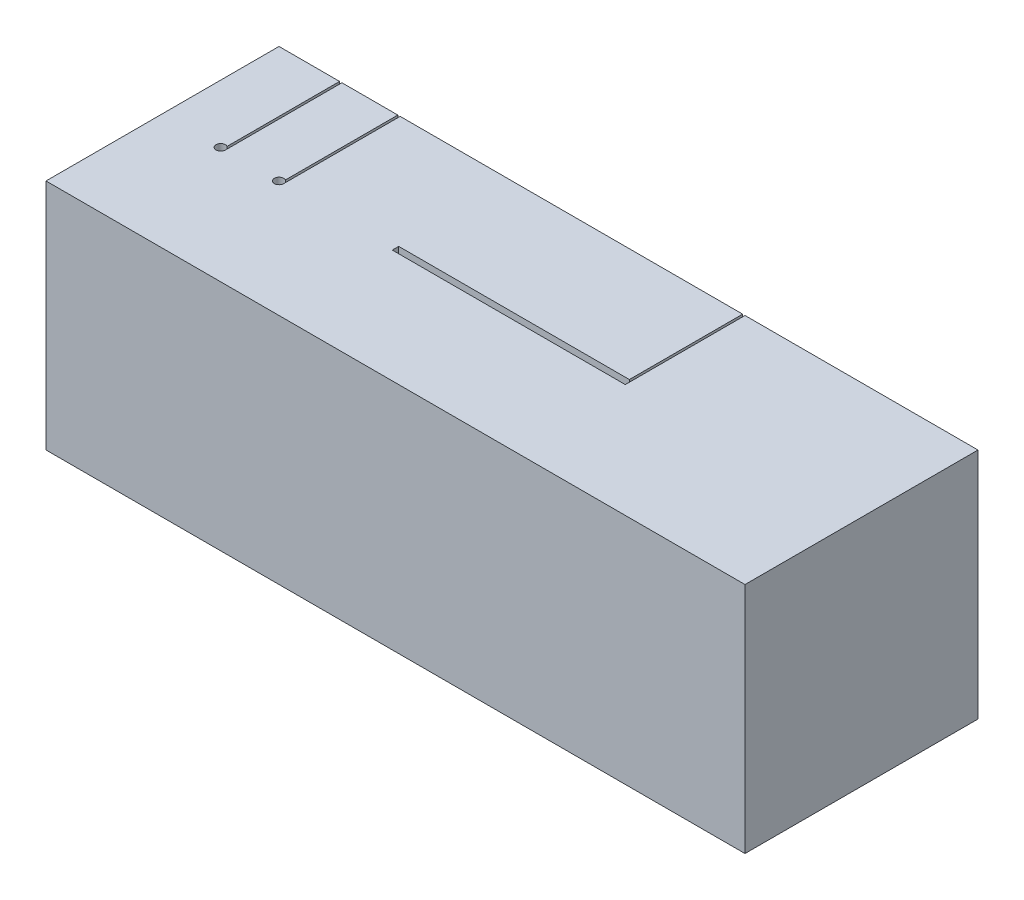
ISO-10303-21;
HEADER;
FILE_DESCRIPTION(('STEP AP214'),'2;1');
FILE_NAME('part.step','',(''),(''),'','','');
FILE_SCHEMA(('AUTOMOTIVE_DESIGN { 1 0 10303 214 1 1 1 1 }'));
ENDSEC;
DATA;
#1=APPLICATION_CONTEXT('core data for automotive mechanical design processes');
#2=APPLICATION_PROTOCOL_DEFINITION('international standard','automotive_design',2000,#1);
#3=PRODUCT_CONTEXT('',#1,'mechanical');
#4=PRODUCT('Part','Part','',(#3));
#5=PRODUCT_RELATED_PRODUCT_CATEGORY('part','',(#4));
#6=PRODUCT_DEFINITION_FORMATION('','',#4);
#7=PRODUCT_DEFINITION_CONTEXT('part definition',#1,'design');
#8=PRODUCT_DEFINITION('design','',#6,#7);
#9=PRODUCT_DEFINITION_SHAPE('','',#8);
#10=(LENGTH_UNIT() NAMED_UNIT(*) SI_UNIT(.MILLI.,.METRE.));
#11=(NAMED_UNIT(*) PLANE_ANGLE_UNIT() SI_UNIT($,.RADIAN.));
#12=(NAMED_UNIT(*) SI_UNIT($,.STERADIAN.) SOLID_ANGLE_UNIT());
#13=UNCERTAINTY_MEASURE_WITH_UNIT(LENGTH_MEASURE(1.E-05),#10,'distance_accuracy_value','');
#14=(GEOMETRIC_REPRESENTATION_CONTEXT(3) GLOBAL_UNCERTAINTY_ASSIGNED_CONTEXT((#13)) GLOBAL_UNIT_ASSIGNED_CONTEXT((#10,
#11,#12)) REPRESENTATION_CONTEXT('',''));
#15=CARTESIAN_POINT('',(0.,0.,0.));
#16=DIRECTION('',(0.,0.,1.));
#17=DIRECTION('',(1.,0.,0.));
#18=AXIS2_PLACEMENT_3D('',#15,#16,#17);
#19=CARTESIAN_POINT('',(0.,0.,0.));
#20=DIRECTION('',(0.,0.,-1.));
#21=DIRECTION('',(-1.,0.,0.));
#22=AXIS2_PLACEMENT_3D('',#19,#20,#21);
#23=PLANE('',#22);
#24=DIRECTION('',(0.,-1.,0.));
#25=VECTOR('',#24,1.);
#26=CARTESIAN_POINT('',(5.39999999999999,20.,0.));
#27=LINE('',#26,#25);
#28=CARTESIAN_POINT('',(5.39999999999999,20.,0.));
#29=VERTEX_POINT('',#28);
#30=CARTESIAN_POINT('',(5.39999999999999,0.,0.));
#31=VERTEX_POINT('',#30);
#32=EDGE_CURVE('E196',#29,#31,#27,.T.);
#33=ORIENTED_EDGE('',*,*,#32,.F.);
#34=DIRECTION('',(-1.,0.,0.));
#35=VECTOR('',#34,1.);
#36=CARTESIAN_POINT('',(0.,20.,0.));
#37=LINE('',#36,#35);
#38=CARTESIAN_POINT('',(10.2,20.,0.));
#39=VERTEX_POINT('',#38);
#40=EDGE_CURVE('E179',#39,#29,#37,.T.);
#41=ORIENTED_EDGE('',*,*,#40,.F.);
#42=DIRECTION('',(0.,-1.,0.));
#43=VECTOR('',#42,1.);
#44=CARTESIAN_POINT('',(10.2,20.,0.));
#45=LINE('',#44,#43);
#46=CARTESIAN_POINT('',(10.2,0.,0.));
#47=VERTEX_POINT('',#46);
#48=EDGE_CURVE('E288',#39,#47,#45,.T.);
#49=ORIENTED_EDGE('',*,*,#48,.T.);
#50=DIRECTION('',(1.,0.,0.));
#51=VECTOR('',#50,1.);
#52=CARTESIAN_POINT('',(0.,0.,0.));
#53=LINE('',#52,#51);
#54=EDGE_CURVE('E242',#31,#47,#53,.T.);
#55=ORIENTED_EDGE('',*,*,#54,.F.);
#56=EDGE_LOOP('',(#33,#41,#49,#55));
#57=FACE_BOUND('',#56,.T.);
#58=ADVANCED_FACE('F35',(#57),#23,.T.);
#59=DIRECTION('',(0.,-1.,0.));
#60=VECTOR('',#59,1.);
#61=CARTESIAN_POINT('',(10.4,20.,0.));
#62=LINE('',#61,#60);
#63=CARTESIAN_POINT('',(10.4,20.,0.));
#64=VERTEX_POINT('',#63);
#65=CARTESIAN_POINT('',(10.4,0.,0.));
#66=VERTEX_POINT('',#65);
#67=EDGE_CURVE('E286',#64,#66,#62,.T.);
#68=ORIENTED_EDGE('',*,*,#67,.F.);
#69=CARTESIAN_POINT('',(39.8,20.,0.));
#70=VERTEX_POINT('',#69);
#71=EDGE_CURVE('E247',#70,#64,#37,.T.);
#72=ORIENTED_EDGE('',*,*,#71,.F.);
#73=DIRECTION('',(0.,-1.,0.));
#74=VECTOR('',#73,1.);
#75=CARTESIAN_POINT('',(39.8,20.,0.));
#76=LINE('',#75,#74);
#77=CARTESIAN_POINT('',(39.8,0.,0.));
#78=VERTEX_POINT('',#77);
#79=EDGE_CURVE('E299',#70,#78,#76,.T.);
#80=ORIENTED_EDGE('',*,*,#79,.T.);
#81=EDGE_CURVE('E310',#66,#78,#53,.T.);
#82=ORIENTED_EDGE('',*,*,#81,.F.);
#83=EDGE_LOOP('',(#68,#72,#80,#82));
#84=FACE_BOUND('',#83,.T.);
#85=ADVANCED_FACE('F343',(#84),#23,.T.);
#86=DIRECTION('',(0.,-1.,0.));
#87=VECTOR('',#86,1.);
#88=CARTESIAN_POINT('',(40.,20.,0.));
#89=LINE('',#88,#87);
#90=CARTESIAN_POINT('',(40.,20.,0.));
#91=VERTEX_POINT('',#90);
#92=CARTESIAN_POINT('',(40.,0.,0.));
#93=VERTEX_POINT('',#92);
#94=EDGE_CURVE('E284',#91,#93,#89,.T.);
#95=ORIENTED_EDGE('',*,*,#94,.F.);
#96=CARTESIAN_POINT('',(60.,20.,0.));
#97=VERTEX_POINT('',#96);
#98=EDGE_CURVE('E228',#97,#91,#37,.T.);
#99=ORIENTED_EDGE('',*,*,#98,.F.);
#100=DIRECTION('',(0.,1.,0.));
#101=VECTOR('',#100,1.);
#102=CARTESIAN_POINT('',(60.,0.,0.));
#103=LINE('',#102,#101);
#104=CARTESIAN_POINT('',(60.,0.,0.));
#105=VERTEX_POINT('',#104);
#106=EDGE_CURVE('E241',#105,#97,#103,.T.);
#107=ORIENTED_EDGE('',*,*,#106,.F.);
#108=EDGE_CURVE('E237',#93,#105,#53,.T.);
#109=ORIENTED_EDGE('',*,*,#108,.F.);
#110=EDGE_LOOP('',(#95,#99,#107,#109));
#111=FACE_BOUND('',#110,.T.);
#112=ADVANCED_FACE('F329',(#111),#23,.T.);
#113=CARTESIAN_POINT('',(0.,0.,20.));
#114=DIRECTION('',(1.,0.,0.));
#115=DIRECTION('',(0.,1.,0.));
#116=AXIS2_PLACEMENT_3D('',#113,#114,#115);
#117=PLANE('',#116);
#118=DIRECTION('',(0.,-1.,0.));
#119=VECTOR('',#118,1.);
#120=CARTESIAN_POINT('',(0.,0.,0.));
#121=LINE('',#120,#119);
#122=CARTESIAN_POINT('',(0.,20.,0.));
#123=VERTEX_POINT('',#122);
#124=CARTESIAN_POINT('',(0.,0.,0.));
#125=VERTEX_POINT('',#124);
#126=EDGE_CURVE('E219',#123,#125,#121,.T.);
#127=ORIENTED_EDGE('',*,*,#126,.T.);
#128=DIRECTION('',(0.,0.,-1.));
#129=VECTOR('',#128,1.);
#130=CARTESIAN_POINT('',(0.,0.,20.));
#131=LINE('',#130,#129);
#132=CARTESIAN_POINT('',(0.,0.,20.));
#133=VERTEX_POINT('',#132);
#134=EDGE_CURVE('E256',#133,#125,#131,.T.);
#135=ORIENTED_EDGE('',*,*,#134,.F.);
#136=DIRECTION('',(0.,-1.,0.));
#137=VECTOR('',#136,1.);
#138=CARTESIAN_POINT('',(0.,0.,20.));
#139=LINE('',#138,#137);
#140=CARTESIAN_POINT('',(0.,20.,20.));
#141=VERTEX_POINT('',#140);
#142=EDGE_CURVE('E224',#141,#133,#139,.T.);
#143=ORIENTED_EDGE('',*,*,#142,.F.);
#144=DIRECTION('',(0.,0.,-1.));
#145=VECTOR('',#144,1.);
#146=CARTESIAN_POINT('',(0.,20.,20.));
#147=LINE('',#146,#145);
#148=EDGE_CURVE('E234',#141,#123,#147,.T.);
#149=ORIENTED_EDGE('',*,*,#148,.T.);
#150=EDGE_LOOP('',(#127,#135,#143,#149));
#151=FACE_BOUND('',#150,.T.);
#152=ADVANCED_FACE('F37',(#151),#117,.F.);
#153=CARTESIAN_POINT('',(0.,0.,20.));
#154=DIRECTION('',(0.,1.,0.));
#155=DIRECTION('',(0.,0.,1.));
#156=AXIS2_PLACEMENT_3D('',#153,#154,#155);
#157=PLANE('',#156);
#158=CARTESIAN_POINT('',(4.99999999999999,0.,10.));
#159=DIRECTION('',(0.,1.,0.));
#160=DIRECTION('',(0.,0.,1.));
#161=AXIS2_PLACEMENT_3D('',#158,#159,#160);
#162=CIRCLE('',#161,0.4);
#163=CARTESIAN_POINT('',(5.19999999999999,0.,9.65358983848622));
#164=VERTEX_POINT('',#163);
#165=CARTESIAN_POINT('',(5.39999999999999,0.,10.));
#166=VERTEX_POINT('',#165);
#167=EDGE_CURVE('E184',#164,#166,#162,.T.);
#168=ORIENTED_EDGE('',*,*,#167,.T.);
#169=DIRECTION('',(0.,0.,1.));
#170=VECTOR('',#169,1.);
#171=CARTESIAN_POINT('',(5.39999999999999,0.,10.));
#172=LINE('',#171,#170);
#173=EDGE_CURVE('E164',#31,#166,#172,.T.);
#174=ORIENTED_EDGE('',*,*,#173,.F.);
#175=ORIENTED_EDGE('',*,*,#54,.T.);
#176=DIRECTION('',(0.,0.,-1.));
#177=VECTOR('',#176,1.);
#178=CARTESIAN_POINT('',(10.2,0.,10.));
#179=LINE('',#178,#177);
#180=CARTESIAN_POINT('',(10.2,0.,9.65358983848622));
#181=VERTEX_POINT('',#180);
#182=EDGE_CURVE('E279',#181,#47,#179,.T.);
#183=ORIENTED_EDGE('',*,*,#182,.F.);
#184=CARTESIAN_POINT('',(9.99999999999999,0.,10.));
#185=DIRECTION('',(0.,1.,0.));
#186=DIRECTION('',(0.,0.,1.));
#187=AXIS2_PLACEMENT_3D('',#184,#185,#186);
#188=CIRCLE('',#187,0.399999999999999);
#189=CARTESIAN_POINT('',(10.4,0.,10.));
#190=VERTEX_POINT('',#189);
#191=EDGE_CURVE('E185',#181,#190,#188,.T.);
#192=ORIENTED_EDGE('',*,*,#191,.T.);
#193=DIRECTION('',(0.,0.,1.));
#194=VECTOR('',#193,1.);
#195=CARTESIAN_POINT('',(10.4,0.,10.));
#196=LINE('',#195,#194);
#197=EDGE_CURVE('E282',#66,#190,#196,.T.);
#198=ORIENTED_EDGE('',*,*,#197,.F.);
#199=ORIENTED_EDGE('',*,*,#81,.T.);
#200=DIRECTION('',(0.,0.,-1.));
#201=VECTOR('',#200,1.);
#202=CARTESIAN_POINT('',(39.8,0.,9.725));
#203=LINE('',#202,#201);
#204=CARTESIAN_POINT('',(39.8,0.,9.725));
#205=VERTEX_POINT('',#204);
#206=EDGE_CURVE('E295',#205,#78,#203,.T.);
#207=ORIENTED_EDGE('',*,*,#206,.F.);
#208=DIRECTION('',(-1.,0.,0.));
#209=VECTOR('',#208,1.);
#210=CARTESIAN_POINT('',(20.,0.,9.725));
#211=LINE('',#210,#209);
#212=CARTESIAN_POINT('',(20.,0.,9.725));
#213=VERTEX_POINT('',#212);
#214=EDGE_CURVE('E206',#205,#213,#211,.T.);
#215=ORIENTED_EDGE('',*,*,#214,.T.);
#216=DIRECTION('',(0.,0.,1.));
#217=VECTOR('',#216,1.);
#218=CARTESIAN_POINT('',(20.,0.,9.725));
#219=LINE('',#218,#217);
#220=CARTESIAN_POINT('',(20.,0.,10.275));
#221=VERTEX_POINT('',#220);
#222=EDGE_CURVE('E197',#213,#221,#219,.T.);
#223=ORIENTED_EDGE('',*,*,#222,.T.);
#224=DIRECTION('',(1.,0.,0.));
#225=VECTOR('',#224,1.);
#226=CARTESIAN_POINT('',(20.,0.,10.275));
#227=LINE('',#226,#225);
#228=CARTESIAN_POINT('',(40.,0.,10.275));
#229=VERTEX_POINT('',#228);
#230=EDGE_CURVE('E200',#221,#229,#227,.T.);
#231=ORIENTED_EDGE('',*,*,#230,.T.);
#232=DIRECTION('',(0.,0.,-1.));
#233=VECTOR('',#232,1.);
#234=CARTESIAN_POINT('',(40.,0.,9.725));
#235=LINE('',#234,#233);
#236=EDGE_CURVE('E204',#229,#93,#235,.T.);
#237=ORIENTED_EDGE('',*,*,#236,.T.);
#238=ORIENTED_EDGE('',*,*,#108,.T.);
#239=DIRECTION('',(0.,0.,-1.));
#240=VECTOR('',#239,1.);
#241=CARTESIAN_POINT('',(60.,0.,20.));
#242=LINE('',#241,#240);
#243=CARTESIAN_POINT('',(60.,0.,20.));
#244=VERTEX_POINT('',#243);
#245=EDGE_CURVE('E253',#244,#105,#242,.T.);
#246=ORIENTED_EDGE('',*,*,#245,.F.);
#247=DIRECTION('',(1.,0.,0.));
#248=VECTOR('',#247,1.);
#249=CARTESIAN_POINT('',(0.,0.,20.));
#250=LINE('',#249,#248);
#251=EDGE_CURVE('E227',#133,#244,#250,.T.);
#252=ORIENTED_EDGE('',*,*,#251,.F.);
#253=ORIENTED_EDGE('',*,*,#134,.T.);
#254=CARTESIAN_POINT('',(5.19999999999999,0.,0.));
#255=VERTEX_POINT('',#254);
#256=EDGE_CURVE('E238',#125,#255,#53,.T.);
#257=ORIENTED_EDGE('',*,*,#256,.T.);
#258=DIRECTION('',(0.,0.,-1.));
#259=VECTOR('',#258,1.);
#260=CARTESIAN_POINT('',(5.19999999999999,0.,10.));
#261=LINE('',#260,#259);
#262=EDGE_CURVE('E180',#164,#255,#261,.T.);
#263=ORIENTED_EDGE('',*,*,#262,.F.);
#264=EDGE_LOOP('',(#168,#174,#175,#183,#192,#198,#199,#207,#215,#223,#231,#237,#238,#246,#252,
#253,#257,#263));
#265=FACE_BOUND('',#264,.T.);
#266=ADVANCED_FACE('F260',(#265),#157,.F.);
#267=CARTESIAN_POINT('',(60.,0.,20.));
#268=DIRECTION('',(-1.,0.,0.));
#269=DIRECTION('',(0.,-1.,0.));
#270=AXIS2_PLACEMENT_3D('',#267,#268,#269);
#271=PLANE('',#270);
#272=ORIENTED_EDGE('',*,*,#106,.T.);
#273=DIRECTION('',(0.,0.,-1.));
#274=VECTOR('',#273,1.);
#275=CARTESIAN_POINT('',(60.,20.,20.));
#276=LINE('',#275,#274);
#277=CARTESIAN_POINT('',(60.,20.,20.));
#278=VERTEX_POINT('',#277);
#279=EDGE_CURVE('E250',#278,#97,#276,.T.);
#280=ORIENTED_EDGE('',*,*,#279,.F.);
#281=DIRECTION('',(0.,1.,0.));
#282=VECTOR('',#281,1.);
#283=CARTESIAN_POINT('',(60.,0.,20.));
#284=LINE('',#283,#282);
#285=EDGE_CURVE('E230',#244,#278,#284,.T.);
#286=ORIENTED_EDGE('',*,*,#285,.F.);
#287=ORIENTED_EDGE('',*,*,#245,.T.);
#288=EDGE_LOOP('',(#272,#280,#286,#287));
#289=FACE_BOUND('',#288,.T.);
#290=ADVANCED_FACE('F349',(#289),#271,.F.);
#291=CARTESIAN_POINT('',(0.,20.,20.));
#292=DIRECTION('',(0.,-1.,0.));
#293=DIRECTION('',(0.,0.,-1.));
#294=AXIS2_PLACEMENT_3D('',#291,#292,#293);
#295=PLANE('',#294);
#296=ORIENTED_EDGE('',*,*,#40,.T.);
#297=DIRECTION('',(0.,0.,1.));
#298=VECTOR('',#297,1.);
#299=CARTESIAN_POINT('',(5.39999999999999,20.,10.));
#300=LINE('',#299,#298);
#301=CARTESIAN_POINT('',(5.39999999999999,20.,10.));
#302=VERTEX_POINT('',#301);
#303=EDGE_CURVE('E161',#29,#302,#300,.T.);
#304=ORIENTED_EDGE('',*,*,#303,.T.);
#305=CARTESIAN_POINT('',(4.99999999999999,20.,10.));
#306=DIRECTION('',(0.,1.,0.));
#307=DIRECTION('',(0.,0.,1.));
#308=AXIS2_PLACEMENT_3D('',#305,#306,#307);
#309=CIRCLE('',#308,0.4);
#310=CARTESIAN_POINT('',(5.19999999999999,20.,9.65358983848622));
#311=VERTEX_POINT('',#310);
#312=EDGE_CURVE('E177',#311,#302,#309,.T.);
#313=ORIENTED_EDGE('',*,*,#312,.F.);
#314=DIRECTION('',(0.,0.,-1.));
#315=VECTOR('',#314,1.);
#316=CARTESIAN_POINT('',(5.19999999999999,20.,10.));
#317=LINE('',#316,#315);
#318=CARTESIAN_POINT('',(5.19999999999999,20.,0.));
#319=VERTEX_POINT('',#318);
#320=EDGE_CURVE('E170',#311,#319,#317,.T.);
#321=ORIENTED_EDGE('',*,*,#320,.T.);
#322=EDGE_CURVE('E244',#319,#123,#37,.T.);
#323=ORIENTED_EDGE('',*,*,#322,.T.);
#324=ORIENTED_EDGE('',*,*,#148,.F.);
#325=DIRECTION('',(-1.,0.,0.));
#326=VECTOR('',#325,1.);
#327=CARTESIAN_POINT('',(0.,20.,20.));
#328=LINE('',#327,#326);
#329=EDGE_CURVE('E232',#278,#141,#328,.T.);
#330=ORIENTED_EDGE('',*,*,#329,.F.);
#331=ORIENTED_EDGE('',*,*,#279,.T.);
#332=ORIENTED_EDGE('',*,*,#98,.T.);
#333=DIRECTION('',(0.,0.,-1.));
#334=VECTOR('',#333,1.);
#335=CARTESIAN_POINT('',(40.,20.,9.725));
#336=LINE('',#335,#334);
#337=CARTESIAN_POINT('',(40.,20.,10.275));
#338=VERTEX_POINT('',#337);
#339=EDGE_CURVE('E213',#338,#91,#336,.T.);
#340=ORIENTED_EDGE('',*,*,#339,.F.);
#341=DIRECTION('',(1.,0.,0.));
#342=VECTOR('',#341,1.);
#343=CARTESIAN_POINT('',(20.,20.,10.275));
#344=LINE('',#343,#342);
#345=CARTESIAN_POINT('',(20.,20.,10.275));
#346=VERTEX_POINT('',#345);
#347=EDGE_CURVE('E210',#346,#338,#344,.T.);
#348=ORIENTED_EDGE('',*,*,#347,.F.);
#349=DIRECTION('',(0.,0.,1.));
#350=VECTOR('',#349,1.);
#351=CARTESIAN_POINT('',(20.,20.,9.725));
#352=LINE('',#351,#350);
#353=CARTESIAN_POINT('',(20.,20.,9.725));
#354=VERTEX_POINT('',#353);
#355=EDGE_CURVE('E187',#354,#346,#352,.T.);
#356=ORIENTED_EDGE('',*,*,#355,.F.);
#357=DIRECTION('',(-1.,0.,0.));
#358=VECTOR('',#357,1.);
#359=CARTESIAN_POINT('',(20.,20.,9.725));
#360=LINE('',#359,#358);
#361=CARTESIAN_POINT('',(39.8,20.,9.725));
#362=VERTEX_POINT('',#361);
#363=EDGE_CURVE('E201',#362,#354,#360,.T.);
#364=ORIENTED_EDGE('',*,*,#363,.F.);
#365=DIRECTION('',(0.,0.,-1.));
#366=VECTOR('',#365,1.);
#367=CARTESIAN_POINT('',(39.8,20.,9.725));
#368=LINE('',#367,#366);
#369=EDGE_CURVE('E50',#362,#70,#368,.T.);
#370=ORIENTED_EDGE('',*,*,#369,.T.);
#371=ORIENTED_EDGE('',*,*,#71,.T.);
#372=DIRECTION('',(0.,0.,1.));
#373=VECTOR('',#372,1.);
#374=CARTESIAN_POINT('',(10.4,20.,10.));
#375=LINE('',#374,#373);
#376=CARTESIAN_POINT('',(10.4,20.,10.));
#377=VERTEX_POINT('',#376);
#378=EDGE_CURVE('E276',#64,#377,#375,.T.);
#379=ORIENTED_EDGE('',*,*,#378,.T.);
#380=CARTESIAN_POINT('',(9.99999999999999,20.,10.));
#381=DIRECTION('',(0.,1.,0.));
#382=DIRECTION('',(0.,0.,1.));
#383=AXIS2_PLACEMENT_3D('',#380,#381,#382);
#384=CIRCLE('',#383,0.399999999999999);
#385=CARTESIAN_POINT('',(10.2,20.,9.65358983848622));
#386=VERTEX_POINT('',#385);
#387=EDGE_CURVE('E190',#386,#377,#384,.T.);
#388=ORIENTED_EDGE('',*,*,#387,.F.);
#389=DIRECTION('',(0.,0.,-1.));
#390=VECTOR('',#389,1.);
#391=CARTESIAN_POINT('',(10.2,20.,10.));
#392=LINE('',#391,#390);
#393=EDGE_CURVE('E58',#386,#39,#392,.T.);
#394=ORIENTED_EDGE('',*,*,#393,.T.);
#395=EDGE_LOOP('',(#296,#304,#313,#321,#323,#324,#330,#331,#332,#340,#348,#356,#364,#370,#371,
#379,#388,#394));
#396=FACE_BOUND('',#395,.T.);
#397=ADVANCED_FACE('F175',(#396),#295,.F.);
#398=CARTESIAN_POINT('',(0.,0.,20.));
#399=DIRECTION('',(0.,0.,-1.));
#400=DIRECTION('',(-1.,0.,0.));
#401=AXIS2_PLACEMENT_3D('',#398,#399,#400);
#402=PLANE('',#401);
#403=ORIENTED_EDGE('',*,*,#142,.T.);
#404=ORIENTED_EDGE('',*,*,#251,.T.);
#405=ORIENTED_EDGE('',*,*,#285,.T.);
#406=ORIENTED_EDGE('',*,*,#329,.T.);
#407=EDGE_LOOP('',(#403,#404,#405,#406));
#408=FACE_BOUND('',#407,.T.);
#409=ADVANCED_FACE('F351',(#408),#402,.F.);
#410=DIRECTION('',(0.,-1.,0.));
#411=VECTOR('',#410,1.);
#412=CARTESIAN_POINT('',(5.19999999999999,20.,0.));
#413=LINE('',#412,#411);
#414=EDGE_CURVE('E169',#319,#255,#413,.T.);
#415=ORIENTED_EDGE('',*,*,#414,.T.);
#416=ORIENTED_EDGE('',*,*,#256,.F.);
#417=ORIENTED_EDGE('',*,*,#126,.F.);
#418=ORIENTED_EDGE('',*,*,#322,.F.);
#419=EDGE_LOOP('',(#415,#416,#417,#418));
#420=FACE_BOUND('',#419,.T.);
#421=ADVANCED_FACE('F270',(#420),#23,.T.);
#422=CARTESIAN_POINT('',(20.,0.,9.725));
#423=DIRECTION('',(-1.,0.,0.));
#424=DIRECTION('',(0.,0.,1.));
#425=AXIS2_PLACEMENT_3D('',#422,#423,#424);
#426=PLANE('',#425);
#427=ORIENTED_EDGE('',*,*,#355,.T.);
#428=DIRECTION('',(0.,1.,0.));
#429=VECTOR('',#428,1.);
#430=CARTESIAN_POINT('',(20.,0.,10.275));
#431=LINE('',#430,#429);
#432=EDGE_CURVE('E208',#221,#346,#431,.T.);
#433=ORIENTED_EDGE('',*,*,#432,.F.);
#434=ORIENTED_EDGE('',*,*,#222,.F.);
#435=DIRECTION('',(0.,1.,0.));
#436=VECTOR('',#435,1.);
#437=CARTESIAN_POINT('',(20.,0.,9.725));
#438=LINE('',#437,#436);
#439=EDGE_CURVE('E216',#213,#354,#438,.T.);
#440=ORIENTED_EDGE('',*,*,#439,.T.);
#441=EDGE_LOOP('',(#427,#433,#434,#440));
#442=FACE_BOUND('',#441,.T.);
#443=ADVANCED_FACE('F315',(#442),#426,.F.);
#444=CARTESIAN_POINT('',(20.,0.,9.725));
#445=DIRECTION('',(0.,0.,-1.));
#446=DIRECTION('',(-1.,0.,0.));
#447=AXIS2_PLACEMENT_3D('',#444,#445,#446);
#448=PLANE('',#447);
#449=ORIENTED_EDGE('',*,*,#214,.F.);
#450=DIRECTION('',(0.,-1.,0.));
#451=VECTOR('',#450,1.);
#452=CARTESIAN_POINT('',(39.8,20.,9.725));
#453=LINE('',#452,#451);
#454=EDGE_CURVE('E294',#362,#205,#453,.T.);
#455=ORIENTED_EDGE('',*,*,#454,.F.);
#456=ORIENTED_EDGE('',*,*,#363,.T.);
#457=ORIENTED_EDGE('',*,*,#439,.F.);
#458=EDGE_LOOP('',(#449,#455,#456,#457));
#459=FACE_BOUND('',#458,.T.);
#460=ADVANCED_FACE('F311',(#459),#448,.F.);
#461=CARTESIAN_POINT('',(40.,0.,9.725));
#462=DIRECTION('',(1.,0.,0.));
#463=DIRECTION('',(0.,0.,-1.));
#464=AXIS2_PLACEMENT_3D('',#461,#462,#463);
#465=PLANE('',#464);
#466=ORIENTED_EDGE('',*,*,#339,.T.);
#467=ORIENTED_EDGE('',*,*,#94,.T.);
#468=ORIENTED_EDGE('',*,*,#236,.F.);
#469=DIRECTION('',(0.,1.,0.));
#470=VECTOR('',#469,1.);
#471=CARTESIAN_POINT('',(40.,0.,10.275));
#472=LINE('',#471,#470);
#473=EDGE_CURVE('E220',#229,#338,#472,.T.);
#474=ORIENTED_EDGE('',*,*,#473,.T.);
#475=EDGE_LOOP('',(#466,#467,#468,#474));
#476=FACE_BOUND('',#475,.T.);
#477=ADVANCED_FACE('F323',(#476),#465,.F.);
#478=CARTESIAN_POINT('',(20.,0.,10.275));
#479=DIRECTION('',(0.,0.,1.));
#480=DIRECTION('',(1.,0.,0.));
#481=AXIS2_PLACEMENT_3D('',#478,#479,#480);
#482=PLANE('',#481);
#483=ORIENTED_EDGE('',*,*,#347,.T.);
#484=ORIENTED_EDGE('',*,*,#473,.F.);
#485=ORIENTED_EDGE('',*,*,#230,.F.);
#486=ORIENTED_EDGE('',*,*,#432,.T.);
#487=EDGE_LOOP('',(#483,#484,#485,#486));
#488=FACE_BOUND('',#487,.T.);
#489=ADVANCED_FACE('F319',(#488),#482,.F.);
#490=CARTESIAN_POINT('',(9.99999999999999,0.,10.));
#491=DIRECTION('',(0.,1.,0.));
#492=DIRECTION('',(0.,0.,1.));
#493=AXIS2_PLACEMENT_3D('',#490,#491,#492);
#494=CYLINDRICAL_SURFACE('',#493,0.399999999999999);
#495=ORIENTED_EDGE('',*,*,#191,.F.);
#496=DIRECTION('',(0.,1.,0.));
#497=VECTOR('',#496,1.);
#498=CARTESIAN_POINT('',(10.2,0.,9.65358983848622));
#499=LINE('',#498,#497);
#500=EDGE_CURVE('E11',#181,#386,#499,.T.);
#501=ORIENTED_EDGE('',*,*,#500,.T.);
#502=ORIENTED_EDGE('',*,*,#387,.T.);
#503=DIRECTION('',(0.,-1.,0.));
#504=VECTOR('',#503,1.);
#505=CARTESIAN_POINT('',(10.4,20.,10.));
#506=LINE('',#505,#504);
#507=EDGE_CURVE('E281',#377,#190,#506,.T.);
#508=ORIENTED_EDGE('',*,*,#507,.T.);
#509=EDGE_LOOP('',(#495,#501,#502,#508));
#510=FACE_BOUND('',#509,.T.);
#511=ADVANCED_FACE('F339',(#510),#494,.F.);
#512=CARTESIAN_POINT('',(4.99999999999999,0.,10.));
#513=DIRECTION('',(0.,1.,0.));
#514=DIRECTION('',(0.,0.,1.));
#515=AXIS2_PLACEMENT_3D('',#512,#513,#514);
#516=CYLINDRICAL_SURFACE('',#515,0.4);
#517=ORIENTED_EDGE('',*,*,#167,.F.);
#518=DIRECTION('',(0.,1.,0.));
#519=VECTOR('',#518,1.);
#520=CARTESIAN_POINT('',(5.19999999999999,0.,9.65358983848622));
#521=LINE('',#520,#519);
#522=EDGE_CURVE('E43',#164,#311,#521,.T.);
#523=ORIENTED_EDGE('',*,*,#522,.T.);
#524=ORIENTED_EDGE('',*,*,#312,.T.);
#525=DIRECTION('',(0.,-1.,0.));
#526=VECTOR('',#525,1.);
#527=CARTESIAN_POINT('',(5.39999999999999,20.,10.));
#528=LINE('',#527,#526);
#529=EDGE_CURVE('E158',#302,#166,#528,.T.);
#530=ORIENTED_EDGE('',*,*,#529,.T.);
#531=EDGE_LOOP('',(#517,#523,#524,#530));
#532=FACE_BOUND('',#531,.T.);
#533=ADVANCED_FACE('F183',(#532),#516,.F.);
#534=CARTESIAN_POINT('',(5.39999999999999,20.,10.));
#535=DIRECTION('',(1.,0.,0.));
#536=DIRECTION('',(0.,0.,-1.));
#537=AXIS2_PLACEMENT_3D('',#534,#535,#536);
#538=PLANE('',#537);
#539=ORIENTED_EDGE('',*,*,#173,.T.);
#540=ORIENTED_EDGE('',*,*,#529,.F.);
#541=ORIENTED_EDGE('',*,*,#303,.F.);
#542=ORIENTED_EDGE('',*,*,#32,.T.);
#543=EDGE_LOOP('',(#539,#540,#541,#542));
#544=FACE_BOUND('',#543,.T.);
#545=ADVANCED_FACE('F160',(#544),#538,.F.);
#546=CARTESIAN_POINT('',(5.19999999999999,20.,10.));
#547=DIRECTION('',(-1.,0.,0.));
#548=DIRECTION('',(0.,0.,1.));
#549=AXIS2_PLACEMENT_3D('',#546,#547,#548);
#550=PLANE('',#549);
#551=ORIENTED_EDGE('',*,*,#262,.T.);
#552=ORIENTED_EDGE('',*,*,#414,.F.);
#553=ORIENTED_EDGE('',*,*,#320,.F.);
#554=ORIENTED_EDGE('',*,*,#522,.F.);
#555=EDGE_LOOP('',(#551,#552,#553,#554));
#556=FACE_BOUND('',#555,.T.);
#557=ADVANCED_FACE('F354',(#556),#550,.F.);
#558=CARTESIAN_POINT('',(10.4,20.,10.));
#559=DIRECTION('',(1.,0.,0.));
#560=DIRECTION('',(0.,0.,-1.));
#561=AXIS2_PLACEMENT_3D('',#558,#559,#560);
#562=PLANE('',#561);
#563=ORIENTED_EDGE('',*,*,#197,.T.);
#564=ORIENTED_EDGE('',*,*,#507,.F.);
#565=ORIENTED_EDGE('',*,*,#378,.F.);
#566=ORIENTED_EDGE('',*,*,#67,.T.);
#567=EDGE_LOOP('',(#563,#564,#565,#566));
#568=FACE_BOUND('',#567,.T.);
#569=ADVANCED_FACE('F356',(#568),#562,.F.);
#570=CARTESIAN_POINT('',(10.2,20.,10.));
#571=DIRECTION('',(-1.,0.,0.));
#572=DIRECTION('',(0.,0.,1.));
#573=AXIS2_PLACEMENT_3D('',#570,#571,#572);
#574=PLANE('',#573);
#575=ORIENTED_EDGE('',*,*,#182,.T.);
#576=ORIENTED_EDGE('',*,*,#48,.F.);
#577=ORIENTED_EDGE('',*,*,#393,.F.);
#578=ORIENTED_EDGE('',*,*,#500,.F.);
#579=EDGE_LOOP('',(#575,#576,#577,#578));
#580=FACE_BOUND('',#579,.T.);
#581=ADVANCED_FACE('F335',(#580),#574,.F.);
#582=CARTESIAN_POINT('',(39.8,20.,9.725));
#583=DIRECTION('',(-1.,0.,0.));
#584=DIRECTION('',(0.,0.,1.));
#585=AXIS2_PLACEMENT_3D('',#582,#583,#584);
#586=PLANE('',#585);
#587=ORIENTED_EDGE('',*,*,#206,.T.);
#588=ORIENTED_EDGE('',*,*,#79,.F.);
#589=ORIENTED_EDGE('',*,*,#369,.F.);
#590=ORIENTED_EDGE('',*,*,#454,.T.);
#591=EDGE_LOOP('',(#587,#588,#589,#590));
#592=FACE_BOUND('',#591,.T.);
#593=ADVANCED_FACE('F302',(#592),#586,.F.);
#594=CLOSED_SHELL('',(#58,#85,#112,#152,#266,#290,#397,#409,#421,#443,#460,#477,#489,#511,#533,
#545,#557,#569,#581,#593));
#595=MANIFOLD_SOLID_BREP('B2',#594);
#596=ADVANCED_BREP_SHAPE_REPRESENTATION('',(#18,#595),#14);
#597=SHAPE_DEFINITION_REPRESENTATION(#9,#596);
ENDSEC;
END-ISO-10303-21;
